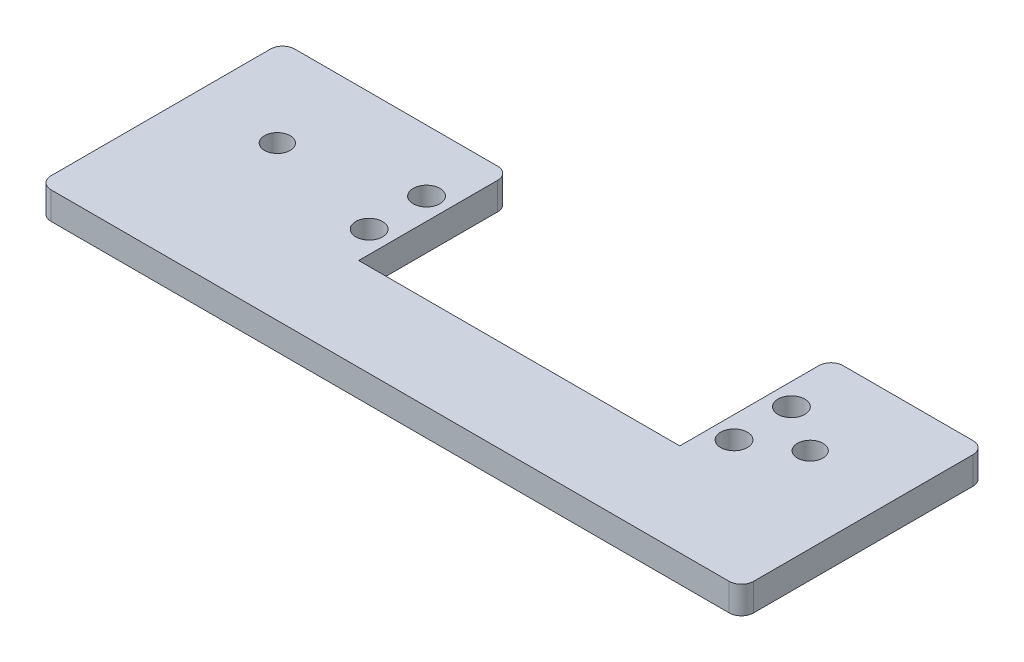
ISO-10303-21;
HEADER;
FILE_DESCRIPTION(('STEP AP214'),'2;1');
FILE_NAME('part.step','',(''),(''),'','','');
FILE_SCHEMA(('AUTOMOTIVE_DESIGN { 1 0 10303 214 1 1 1 1 }'));
ENDSEC;
DATA;
#1=APPLICATION_CONTEXT('core data for automotive mechanical design processes');
#2=APPLICATION_PROTOCOL_DEFINITION('international standard','automotive_design',2000,#1);
#3=PRODUCT_CONTEXT('',#1,'mechanical');
#4=PRODUCT('Part','Part','',(#3));
#5=PRODUCT_RELATED_PRODUCT_CATEGORY('part','',(#4));
#6=PRODUCT_DEFINITION_FORMATION('','',#4);
#7=PRODUCT_DEFINITION_CONTEXT('part definition',#1,'design');
#8=PRODUCT_DEFINITION('design','',#6,#7);
#9=PRODUCT_DEFINITION_SHAPE('','',#8);
#10=(LENGTH_UNIT() NAMED_UNIT(*) SI_UNIT(.MILLI.,.METRE.));
#11=(NAMED_UNIT(*) PLANE_ANGLE_UNIT() SI_UNIT($,.RADIAN.));
#12=(NAMED_UNIT(*) SI_UNIT($,.STERADIAN.) SOLID_ANGLE_UNIT());
#13=UNCERTAINTY_MEASURE_WITH_UNIT(LENGTH_MEASURE(1.E-05),#10,'distance_accuracy_value','');
#14=(GEOMETRIC_REPRESENTATION_CONTEXT(3) GLOBAL_UNCERTAINTY_ASSIGNED_CONTEXT((#13)) GLOBAL_UNIT_ASSIGNED_CONTEXT((#10,
#11,#12)) REPRESENTATION_CONTEXT('',''));
#15=CARTESIAN_POINT('',(0.,0.,0.));
#16=DIRECTION('',(0.,0.,1.));
#17=DIRECTION('',(1.,0.,0.));
#18=AXIS2_PLACEMENT_3D('',#15,#16,#17);
#19=CARTESIAN_POINT('',(34.40167516,4.5,-18.0390035104876));
#20=DIRECTION('',(0.,-1.,0.));
#21=DIRECTION('',(0.,0.,-1.));
#22=AXIS2_PLACEMENT_3D('',#19,#20,#21);
#23=PLANE('',#22);
#24=CARTESIAN_POINT('',(36.0016750719999,4.5,-0.504003432487632));
#25=DIRECTION('',(0.,1.,0.));
#26=DIRECTION('',(0.,0.,1.));
#27=AXIS2_PLACEMENT_3D('',#24,#25,#26);
#28=CIRCLE('',#27,2.2);
#29=CARTESIAN_POINT('',(36.0016750719999,4.5,1.69599656751237));
#30=VERTEX_POINT('',#29);
#31=EDGE_CURVE('E326',#30,#30,#28,.T.);
#32=ORIENTED_EDGE('',*,*,#31,.F.);
#33=EDGE_LOOP('',(#32));
#34=FACE_BOUND('',#33,.T.);
#35=CARTESIAN_POINT('',(-23.988324752,4.5,-9.93400343248761));
#36=DIRECTION('',(0.,1.,0.));
#37=DIRECTION('',(0.,0.,1.));
#38=AXIS2_PLACEMENT_3D('',#35,#36,#37);
#39=CIRCLE('',#38,2.2);
#40=CARTESIAN_POINT('',(-23.988324752,4.5,-7.7340034324876));
#41=VERTEX_POINT('',#40);
#42=EDGE_CURVE('E338',#41,#41,#39,.T.);
#43=ORIENTED_EDGE('',*,*,#42,.F.);
#44=EDGE_LOOP('',(#43));
#45=FACE_BOUND('',#44,.T.);
#46=CARTESIAN_POINT('',(-43.8023,4.5,-5.21900343248762));
#47=DIRECTION('',(0.,1.,0.));
#48=DIRECTION('',(0.,0.,1.));
#49=AXIS2_PLACEMENT_3D('',#46,#47,#48);
#50=CIRCLE('',#49,2.1082);
#51=CARTESIAN_POINT('',(-43.8023,4.5,-3.11080343248762));
#52=VERTEX_POINT('',#51);
#53=EDGE_CURVE('E170',#52,#52,#50,.T.);
#54=ORIENTED_EDGE('',*,*,#53,.F.);
#55=EDGE_LOOP('',(#54));
#56=FACE_BOUND('',#55,.T.);
#57=DIRECTION('',(-1.,0.,0.));
#58=VECTOR('',#57,1.);
#59=CARTESIAN_POINT('',(-20.38832484,4.5,4.81599656751238));
#60=LINE('',#59,#58);
#61=CARTESIAN_POINT('',(32.40167516,4.5,4.81599656751238));
#62=VERTEX_POINT('',#61);
#63=CARTESIAN_POINT('',(-20.38832484,4.5,4.81599656751238));
#64=VERTEX_POINT('',#63);
#65=EDGE_CURVE('E193',#62,#64,#60,.T.);
#66=ORIENTED_EDGE('',*,*,#65,.T.);
#67=DIRECTION('',(0.,0.,-1.));
#68=VECTOR('',#67,1.);
#69=CARTESIAN_POINT('',(-20.38832484,4.5,-18.0390035104876));
#70=LINE('',#69,#68);
#71=CARTESIAN_POINT('',(-20.38832484,4.5,-18.0390035104876));
#72=VERTEX_POINT('',#71);
#73=EDGE_CURVE('E111',#64,#72,#70,.T.);
#74=ORIENTED_EDGE('',*,*,#73,.T.);
#75=CARTESIAN_POINT('',(-22.38832484,4.5,-18.0390035104876));
#76=DIRECTION('',(0.,1.,0.));
#77=DIRECTION('',(0.,0.,1.));
#78=AXIS2_PLACEMENT_3D('',#75,#76,#77);
#79=CIRCLE('',#78,2.);
#80=CARTESIAN_POINT('',(-22.38832484,4.5,-20.0390035104876));
#81=VERTEX_POINT('',#80);
#82=EDGE_CURVE('E226',#72,#81,#79,.T.);
#83=ORIENTED_EDGE('',*,*,#82,.T.);
#84=DIRECTION('',(-1.,0.,0.));
#85=VECTOR('',#84,1.);
#86=CARTESIAN_POINT('',(-22.38832484,4.5,-20.0390035104876));
#87=LINE('',#86,#85);
#88=CARTESIAN_POINT('',(-55.75,4.5,-20.0390035104876));
#89=VERTEX_POINT('',#88);
#90=EDGE_CURVE('E245',#81,#89,#87,.T.);
#91=ORIENTED_EDGE('',*,*,#90,.T.);
#92=CARTESIAN_POINT('',(-55.75,4.5,-18.0390035104876));
#93=DIRECTION('',(0.,1.,0.));
#94=DIRECTION('',(0.,0.,1.));
#95=AXIS2_PLACEMENT_3D('',#92,#93,#94);
#96=CIRCLE('',#95,2.);
#97=CARTESIAN_POINT('',(-57.75,4.5,-18.0390035104876));
#98=VERTEX_POINT('',#97);
#99=EDGE_CURVE('E242',#89,#98,#96,.T.);
#100=ORIENTED_EDGE('',*,*,#99,.T.);
#101=DIRECTION('',(0.,0.,1.));
#102=VECTOR('',#101,1.);
#103=CARTESIAN_POINT('',(-57.75,4.5,-18.0390035104876));
#104=LINE('',#103,#102);
#105=CARTESIAN_POINT('',(-57.75,4.5,18.0390035104876));
#106=VERTEX_POINT('',#105);
#107=EDGE_CURVE('E244',#98,#106,#104,.T.);
#108=ORIENTED_EDGE('',*,*,#107,.T.);
#109=CARTESIAN_POINT('',(-55.75,4.5,18.0390035104876));
#110=DIRECTION('',(0.,1.,0.));
#111=DIRECTION('',(0.,0.,-1.));
#112=AXIS2_PLACEMENT_3D('',#109,#110,#111);
#113=CIRCLE('',#112,2.);
#114=CARTESIAN_POINT('',(-55.75,4.5,20.0390035104876));
#115=VERTEX_POINT('',#114);
#116=EDGE_CURVE('E247',#106,#115,#113,.T.);
#117=ORIENTED_EDGE('',*,*,#116,.T.);
#118=DIRECTION('',(1.,0.,0.));
#119=VECTOR('',#118,1.);
#120=CARTESIAN_POINT('',(55.7499999999999,4.5,20.0390035104876));
#121=LINE('',#120,#119);
#122=CARTESIAN_POINT('',(55.7499999999999,4.5,20.0390035104876));
#123=VERTEX_POINT('',#122);
#124=EDGE_CURVE('E253',#115,#123,#121,.T.);
#125=ORIENTED_EDGE('',*,*,#124,.T.);
#126=CARTESIAN_POINT('',(55.7499999999999,4.5,18.0390035104876));
#127=DIRECTION('',(0.,1.,0.));
#128=DIRECTION('',(0.,0.,-1.));
#129=AXIS2_PLACEMENT_3D('',#126,#127,#128);
#130=CIRCLE('',#129,2.);
#131=CARTESIAN_POINT('',(57.7499999999999,4.5,18.0390035104876));
#132=VERTEX_POINT('',#131);
#133=EDGE_CURVE('E255',#123,#132,#130,.T.);
#134=ORIENTED_EDGE('',*,*,#133,.T.);
#135=DIRECTION('',(0.,0.,-1.));
#136=VECTOR('',#135,1.);
#137=CARTESIAN_POINT('',(57.7499999999999,4.5,-18.0390035104876));
#138=LINE('',#137,#136);
#139=CARTESIAN_POINT('',(57.7499999999999,4.5,-18.0390035104876));
#140=VERTEX_POINT('',#139);
#141=EDGE_CURVE('E257',#132,#140,#138,.T.);
#142=ORIENTED_EDGE('',*,*,#141,.T.);
#143=CARTESIAN_POINT('',(55.7499999999999,4.5,-18.0390035104876));
#144=DIRECTION('',(0.,1.,0.));
#145=DIRECTION('',(0.,0.,-1.));
#146=AXIS2_PLACEMENT_3D('',#143,#144,#145);
#147=CIRCLE('',#146,2.);
#148=CARTESIAN_POINT('',(55.7499999999999,4.5,-20.0390035104876));
#149=VERTEX_POINT('',#148);
#150=EDGE_CURVE('E148',#140,#149,#147,.T.);
#151=ORIENTED_EDGE('',*,*,#150,.T.);
#152=DIRECTION('',(-1.,0.,0.));
#153=VECTOR('',#152,1.);
#154=CARTESIAN_POINT('',(55.7499999999999,4.5,-20.0390035104876));
#155=LINE('',#154,#153);
#156=CARTESIAN_POINT('',(34.40167516,4.5,-20.0390035104876));
#157=VERTEX_POINT('',#156);
#158=EDGE_CURVE('E142',#149,#157,#155,.T.);
#159=ORIENTED_EDGE('',*,*,#158,.T.);
#160=CARTESIAN_POINT('',(34.40167516,4.5,-18.0390035104876));
#161=DIRECTION('',(0.,1.,0.));
#162=DIRECTION('',(0.,0.,-1.));
#163=AXIS2_PLACEMENT_3D('',#160,#161,#162);
#164=CIRCLE('',#163,2.);
#165=CARTESIAN_POINT('',(32.40167516,4.5,-18.0390035104876));
#166=VERTEX_POINT('',#165);
#167=EDGE_CURVE('E146',#157,#166,#164,.T.);
#168=ORIENTED_EDGE('',*,*,#167,.T.);
#169=DIRECTION('',(0.,0.,1.));
#170=VECTOR('',#169,1.);
#171=CARTESIAN_POINT('',(32.40167516,4.5,-18.0390035104876));
#172=LINE('',#171,#170);
#173=EDGE_CURVE('E50',#166,#62,#172,.T.);
#174=ORIENTED_EDGE('',*,*,#173,.T.);
#175=EDGE_LOOP('',(#66,#74,#83,#91,#100,#108,#117,#125,#134,#142,#151,#159,#168,#174));
#176=FACE_BOUND('',#175,.T.);
#177=CARTESIAN_POINT('',(43.8023,4.5,-5.21900343248762));
#178=DIRECTION('',(0.,1.,0.));
#179=DIRECTION('',(0.,0.,-1.));
#180=AXIS2_PLACEMENT_3D('',#177,#178,#179);
#181=CIRCLE('',#180,2.1082);
#182=CARTESIAN_POINT('',(43.8023,4.5,-7.32720343248762));
#183=VERTEX_POINT('',#182);
#184=EDGE_CURVE('E344',#183,#183,#181,.T.);
#185=ORIENTED_EDGE('',*,*,#184,.F.);
#186=EDGE_LOOP('',(#185));
#187=FACE_BOUND('',#186,.T.);
#188=CARTESIAN_POINT('',(36.001675072,4.5,-9.93400343248761));
#189=DIRECTION('',(0.,1.,0.));
#190=DIRECTION('',(0.,0.,-1.));
#191=AXIS2_PLACEMENT_3D('',#188,#189,#190);
#192=CIRCLE('',#191,2.2);
#193=CARTESIAN_POINT('',(36.001675072,4.5,-12.1340034324876));
#194=VERTEX_POINT('',#193);
#195=EDGE_CURVE('E332',#194,#194,#192,.T.);
#196=ORIENTED_EDGE('',*,*,#195,.F.);
#197=EDGE_LOOP('',(#196));
#198=FACE_BOUND('',#197,.T.);
#199=CARTESIAN_POINT('',(-23.988324752,4.5,-0.504003432487632));
#200=DIRECTION('',(0.,1.,0.));
#201=DIRECTION('',(0.,0.,-1.));
#202=AXIS2_PLACEMENT_3D('',#199,#200,#201);
#203=CIRCLE('',#202,2.2);
#204=CARTESIAN_POINT('',(-23.988324752,4.5,-2.70400343248763));
#205=VERTEX_POINT('',#204);
#206=EDGE_CURVE('E317',#205,#205,#203,.T.);
#207=ORIENTED_EDGE('',*,*,#206,.F.);
#208=EDGE_LOOP('',(#207));
#209=FACE_BOUND('',#208,.T.);
#210=ADVANCED_FACE('F33',(#34,#45,#56,#176,#187,#198,#209),#23,.F.);
#211=CARTESIAN_POINT('',(34.40167516,0.,-18.0390035104876));
#212=DIRECTION('',(0.,-1.,0.));
#213=DIRECTION('',(0.,0.,-1.));
#214=AXIS2_PLACEMENT_3D('',#211,#212,#213);
#215=PLANE('',#214);
#216=CARTESIAN_POINT('',(36.0016750719999,0.,-0.504003432487632));
#217=DIRECTION('',(0.,1.,0.));
#218=DIRECTION('',(0.,0.,1.));
#219=AXIS2_PLACEMENT_3D('',#216,#217,#218);
#220=CIRCLE('',#219,2.2);
#221=CARTESIAN_POINT('',(36.0016750719999,0.,1.69599656751237));
#222=VERTEX_POINT('',#221);
#223=EDGE_CURVE('E323',#222,#222,#220,.T.);
#224=ORIENTED_EDGE('',*,*,#223,.T.);
#225=EDGE_LOOP('',(#224));
#226=FACE_BOUND('',#225,.T.);
#227=CARTESIAN_POINT('',(-23.988324752,0.,-9.93400343248761));
#228=DIRECTION('',(0.,1.,0.));
#229=DIRECTION('',(0.,0.,1.));
#230=AXIS2_PLACEMENT_3D('',#227,#228,#229);
#231=CIRCLE('',#230,2.2);
#232=CARTESIAN_POINT('',(-23.988324752,0.,-7.7340034324876));
#233=VERTEX_POINT('',#232);
#234=EDGE_CURVE('E335',#233,#233,#231,.T.);
#235=ORIENTED_EDGE('',*,*,#234,.T.);
#236=EDGE_LOOP('',(#235));
#237=FACE_BOUND('',#236,.T.);
#238=CARTESIAN_POINT('',(-43.8023,0.,-5.21900343248762));
#239=DIRECTION('',(0.,1.,0.));
#240=DIRECTION('',(0.,0.,1.));
#241=AXIS2_PLACEMENT_3D('',#238,#239,#240);
#242=CIRCLE('',#241,2.1082);
#243=CARTESIAN_POINT('',(-43.8023,0.,-3.11080343248762));
#244=VERTEX_POINT('',#243);
#245=EDGE_CURVE('E347',#244,#244,#242,.T.);
#246=ORIENTED_EDGE('',*,*,#245,.T.);
#247=EDGE_LOOP('',(#246));
#248=FACE_BOUND('',#247,.T.);
#249=DIRECTION('',(-1.,0.,0.));
#250=VECTOR('',#249,1.);
#251=CARTESIAN_POINT('',(-20.38832484,0.,4.81599656751238));
#252=LINE('',#251,#250);
#253=CARTESIAN_POINT('',(32.40167516,0.,4.81599656751238));
#254=VERTEX_POINT('',#253);
#255=CARTESIAN_POINT('',(-20.38832484,0.,4.81599656751238));
#256=VERTEX_POINT('',#255);
#257=EDGE_CURVE('E166',#254,#256,#252,.T.);
#258=ORIENTED_EDGE('',*,*,#257,.F.);
#259=DIRECTION('',(0.,0.,1.));
#260=VECTOR('',#259,1.);
#261=CARTESIAN_POINT('',(32.40167516,0.,-18.0390035104876));
#262=LINE('',#261,#260);
#263=CARTESIAN_POINT('',(32.40167516,0.,-18.0390035104876));
#264=VERTEX_POINT('',#263);
#265=EDGE_CURVE('E103',#264,#254,#262,.T.);
#266=ORIENTED_EDGE('',*,*,#265,.F.);
#267=CARTESIAN_POINT('',(34.40167516,0.,-18.0390035104876));
#268=DIRECTION('',(0.,1.,0.));
#269=DIRECTION('',(0.,0.,-1.));
#270=AXIS2_PLACEMENT_3D('',#267,#268,#269);
#271=CIRCLE('',#270,2.);
#272=CARTESIAN_POINT('',(34.40167516,0.,-20.0390035104876));
#273=VERTEX_POINT('',#272);
#274=EDGE_CURVE('E97',#273,#264,#271,.T.);
#275=ORIENTED_EDGE('',*,*,#274,.F.);
#276=DIRECTION('',(-1.,0.,0.));
#277=VECTOR('',#276,1.);
#278=CARTESIAN_POINT('',(55.7499999999999,0.,-20.0390035104876));
#279=LINE('',#278,#277);
#280=CARTESIAN_POINT('',(55.7499999999999,0.,-20.0390035104876));
#281=VERTEX_POINT('',#280);
#282=EDGE_CURVE('E156',#281,#273,#279,.T.);
#283=ORIENTED_EDGE('',*,*,#282,.F.);
#284=CARTESIAN_POINT('',(55.7499999999999,0.,-18.0390035104876));
#285=DIRECTION('',(0.,1.,0.));
#286=DIRECTION('',(0.,0.,-1.));
#287=AXIS2_PLACEMENT_3D('',#284,#285,#286);
#288=CIRCLE('',#287,2.);
#289=CARTESIAN_POINT('',(57.7499999999999,0.,-18.0390035104876));
#290=VERTEX_POINT('',#289);
#291=EDGE_CURVE('E188',#290,#281,#288,.T.);
#292=ORIENTED_EDGE('',*,*,#291,.F.);
#293=DIRECTION('',(0.,0.,-1.));
#294=VECTOR('',#293,1.);
#295=CARTESIAN_POINT('',(57.7499999999999,0.,-18.0390035104876));
#296=LINE('',#295,#294);
#297=CARTESIAN_POINT('',(57.7499999999999,0.,18.0390035104876));
#298=VERTEX_POINT('',#297);
#299=EDGE_CURVE('E186',#298,#290,#296,.T.);
#300=ORIENTED_EDGE('',*,*,#299,.F.);
#301=CARTESIAN_POINT('',(55.7499999999999,0.,18.0390035104876));
#302=DIRECTION('',(0.,1.,0.));
#303=DIRECTION('',(0.,0.,-1.));
#304=AXIS2_PLACEMENT_3D('',#301,#302,#303);
#305=CIRCLE('',#304,2.);
#306=CARTESIAN_POINT('',(55.7499999999999,0.,20.0390035104876));
#307=VERTEX_POINT('',#306);
#308=EDGE_CURVE('E184',#307,#298,#305,.T.);
#309=ORIENTED_EDGE('',*,*,#308,.F.);
#310=DIRECTION('',(1.,0.,0.));
#311=VECTOR('',#310,1.);
#312=CARTESIAN_POINT('',(55.7499999999999,0.,20.0390035104876));
#313=LINE('',#312,#311);
#314=CARTESIAN_POINT('',(-55.75,0.,20.0390035104876));
#315=VERTEX_POINT('',#314);
#316=EDGE_CURVE('E182',#315,#307,#313,.T.);
#317=ORIENTED_EDGE('',*,*,#316,.F.);
#318=CARTESIAN_POINT('',(-55.75,0.,18.0390035104876));
#319=DIRECTION('',(0.,1.,0.));
#320=DIRECTION('',(0.,0.,-1.));
#321=AXIS2_PLACEMENT_3D('',#318,#319,#320);
#322=CIRCLE('',#321,2.);
#323=CARTESIAN_POINT('',(-57.75,0.,18.0390035104876));
#324=VERTEX_POINT('',#323);
#325=EDGE_CURVE('E180',#324,#315,#322,.T.);
#326=ORIENTED_EDGE('',*,*,#325,.F.);
#327=DIRECTION('',(0.,0.,1.));
#328=VECTOR('',#327,1.);
#329=CARTESIAN_POINT('',(-57.75,0.,-18.0390035104876));
#330=LINE('',#329,#328);
#331=CARTESIAN_POINT('',(-57.75,0.,-18.0390035104876));
#332=VERTEX_POINT('',#331);
#333=EDGE_CURVE('E178',#332,#324,#330,.T.);
#334=ORIENTED_EDGE('',*,*,#333,.F.);
#335=CARTESIAN_POINT('',(-55.75,0.,-18.0390035104876));
#336=DIRECTION('',(0.,1.,0.));
#337=DIRECTION('',(0.,0.,1.));
#338=AXIS2_PLACEMENT_3D('',#335,#336,#337);
#339=CIRCLE('',#338,2.);
#340=CARTESIAN_POINT('',(-55.75,0.,-20.0390035104876));
#341=VERTEX_POINT('',#340);
#342=EDGE_CURVE('E176',#341,#332,#339,.T.);
#343=ORIENTED_EDGE('',*,*,#342,.F.);
#344=DIRECTION('',(-1.,0.,0.));
#345=VECTOR('',#344,1.);
#346=CARTESIAN_POINT('',(-22.38832484,0.,-20.0390035104876));
#347=LINE('',#346,#345);
#348=CARTESIAN_POINT('',(-22.38832484,0.,-20.0390035104876));
#349=VERTEX_POINT('',#348);
#350=EDGE_CURVE('E174',#349,#341,#347,.T.);
#351=ORIENTED_EDGE('',*,*,#350,.F.);
#352=CARTESIAN_POINT('',(-22.38832484,0.,-18.0390035104876));
#353=DIRECTION('',(0.,1.,0.));
#354=DIRECTION('',(0.,0.,1.));
#355=AXIS2_PLACEMENT_3D('',#352,#353,#354);
#356=CIRCLE('',#355,2.);
#357=CARTESIAN_POINT('',(-20.38832484,0.,-18.0390035104876));
#358=VERTEX_POINT('',#357);
#359=EDGE_CURVE('E172',#358,#349,#356,.T.);
#360=ORIENTED_EDGE('',*,*,#359,.F.);
#361=DIRECTION('',(0.,0.,-1.));
#362=VECTOR('',#361,1.);
#363=CARTESIAN_POINT('',(-20.38832484,0.,-18.0390035104876));
#364=LINE('',#363,#362);
#365=EDGE_CURVE('E169',#256,#358,#364,.T.);
#366=ORIENTED_EDGE('',*,*,#365,.F.);
#367=EDGE_LOOP('',(#258,#266,#275,#283,#292,#300,#309,#317,#326,#334,#343,#351,#360,#366));
#368=FACE_BOUND('',#367,.T.);
#369=CARTESIAN_POINT('',(43.8023,0.,-5.21900343248762));
#370=DIRECTION('',(0.,1.,0.));
#371=DIRECTION('',(0.,0.,-1.));
#372=AXIS2_PLACEMENT_3D('',#369,#370,#371);
#373=CIRCLE('',#372,2.1082);
#374=CARTESIAN_POINT('',(43.8023,0.,-7.32720343248762));
#375=VERTEX_POINT('',#374);
#376=EDGE_CURVE('E341',#375,#375,#373,.T.);
#377=ORIENTED_EDGE('',*,*,#376,.T.);
#378=EDGE_LOOP('',(#377));
#379=FACE_BOUND('',#378,.T.);
#380=CARTESIAN_POINT('',(36.001675072,0.,-9.93400343248761));
#381=DIRECTION('',(0.,1.,0.));
#382=DIRECTION('',(0.,0.,-1.));
#383=AXIS2_PLACEMENT_3D('',#380,#381,#382);
#384=CIRCLE('',#383,2.2);
#385=CARTESIAN_POINT('',(36.001675072,0.,-12.1340034324876));
#386=VERTEX_POINT('',#385);
#387=EDGE_CURVE('E329',#386,#386,#384,.T.);
#388=ORIENTED_EDGE('',*,*,#387,.T.);
#389=EDGE_LOOP('',(#388));
#390=FACE_BOUND('',#389,.T.);
#391=CARTESIAN_POINT('',(-23.988324752,0.,-0.504003432487632));
#392=DIRECTION('',(0.,1.,0.));
#393=DIRECTION('',(0.,0.,-1.));
#394=AXIS2_PLACEMENT_3D('',#391,#392,#393);
#395=CIRCLE('',#394,2.2);
#396=CARTESIAN_POINT('',(-23.988324752,0.,-2.70400343248763));
#397=VERTEX_POINT('',#396);
#398=EDGE_CURVE('E320',#397,#397,#395,.T.);
#399=ORIENTED_EDGE('',*,*,#398,.T.);
#400=EDGE_LOOP('',(#399));
#401=FACE_BOUND('',#400,.T.);
#402=ADVANCED_FACE('F230',(#226,#237,#248,#368,#379,#390,#401),#215,.T.);
#403=CARTESIAN_POINT('',(-20.38832484,4.5,4.81599656751238));
#404=DIRECTION('',(0.,0.,1.));
#405=DIRECTION('',(1.,0.,0.));
#406=AXIS2_PLACEMENT_3D('',#403,#404,#405);
#407=PLANE('',#406);
#408=ORIENTED_EDGE('',*,*,#257,.T.);
#409=DIRECTION('',(0.,-1.,0.));
#410=VECTOR('',#409,1.);
#411=CARTESIAN_POINT('',(-20.38832484,4.5,4.81599656751238));
#412=LINE('',#411,#410);
#413=EDGE_CURVE('E11',#64,#256,#412,.T.);
#414=ORIENTED_EDGE('',*,*,#413,.F.);
#415=ORIENTED_EDGE('',*,*,#65,.F.);
#416=DIRECTION('',(0.,-1.,0.));
#417=VECTOR('',#416,1.);
#418=CARTESIAN_POINT('',(32.40167516,4.5,4.81599656751238));
#419=LINE('',#418,#417);
#420=EDGE_CURVE('E162',#62,#254,#419,.T.);
#421=ORIENTED_EDGE('',*,*,#420,.T.);
#422=EDGE_LOOP('',(#408,#414,#415,#421));
#423=FACE_BOUND('',#422,.T.);
#424=ADVANCED_FACE('F35',(#423),#407,.F.);
#425=CARTESIAN_POINT('',(-20.38832484,4.5,-18.0390035104876));
#426=DIRECTION('',(-1.,0.,0.));
#427=DIRECTION('',(0.,0.,1.));
#428=AXIS2_PLACEMENT_3D('',#425,#426,#427);
#429=PLANE('',#428);
#430=ORIENTED_EDGE('',*,*,#365,.T.);
#431=DIRECTION('',(0.,-1.,0.));
#432=VECTOR('',#431,1.);
#433=CARTESIAN_POINT('',(-20.38832484,4.5,-18.0390035104876));
#434=LINE('',#433,#432);
#435=EDGE_CURVE('E42',#72,#358,#434,.T.);
#436=ORIENTED_EDGE('',*,*,#435,.F.);
#437=ORIENTED_EDGE('',*,*,#73,.F.);
#438=ORIENTED_EDGE('',*,*,#413,.T.);
#439=EDGE_LOOP('',(#430,#436,#437,#438));
#440=FACE_BOUND('',#439,.T.);
#441=ADVANCED_FACE('F494',(#440),#429,.F.);
#442=CARTESIAN_POINT('',(-22.38832484,4.5,-18.0390035104876));
#443=DIRECTION('',(0.,-1.,0.));
#444=DIRECTION('',(0.,0.,-1.));
#445=AXIS2_PLACEMENT_3D('',#442,#443,#444);
#446=CYLINDRICAL_SURFACE('',#445,2.);
#447=ORIENTED_EDGE('',*,*,#359,.T.);
#448=DIRECTION('',(0.,-1.,0.));
#449=VECTOR('',#448,1.);
#450=CARTESIAN_POINT('',(-22.38832484,4.5,-20.0390035104876));
#451=LINE('',#450,#449);
#452=EDGE_CURVE('E218',#81,#349,#451,.T.);
#453=ORIENTED_EDGE('',*,*,#452,.F.);
#454=ORIENTED_EDGE('',*,*,#82,.F.);
#455=ORIENTED_EDGE('',*,*,#435,.T.);
#456=EDGE_LOOP('',(#447,#453,#454,#455));
#457=FACE_BOUND('',#456,.T.);
#458=ADVANCED_FACE('F224',(#457),#446,.T.);
#459=CARTESIAN_POINT('',(-22.38832484,4.5,-20.0390035104876));
#460=DIRECTION('',(0.,0.,1.));
#461=DIRECTION('',(1.,0.,0.));
#462=AXIS2_PLACEMENT_3D('',#459,#460,#461);
#463=PLANE('',#462);
#464=ORIENTED_EDGE('',*,*,#350,.T.);
#465=DIRECTION('',(0.,-1.,0.));
#466=VECTOR('',#465,1.);
#467=CARTESIAN_POINT('',(-55.75,4.5,-20.0390035104876));
#468=LINE('',#467,#466);
#469=EDGE_CURVE('E215',#89,#341,#468,.T.);
#470=ORIENTED_EDGE('',*,*,#469,.F.);
#471=ORIENTED_EDGE('',*,*,#90,.F.);
#472=ORIENTED_EDGE('',*,*,#452,.T.);
#473=EDGE_LOOP('',(#464,#470,#471,#472));
#474=FACE_BOUND('',#473,.T.);
#475=ADVANCED_FACE('F236',(#474),#463,.F.);
#476=CARTESIAN_POINT('',(-55.75,4.5,-18.0390035104876));
#477=DIRECTION('',(0.,-1.,0.));
#478=DIRECTION('',(0.,0.,-1.));
#479=AXIS2_PLACEMENT_3D('',#476,#477,#478);
#480=CYLINDRICAL_SURFACE('',#479,2.);
#481=ORIENTED_EDGE('',*,*,#342,.T.);
#482=DIRECTION('',(0.,-1.,0.));
#483=VECTOR('',#482,1.);
#484=CARTESIAN_POINT('',(-57.75,4.5,-18.0390035104876));
#485=LINE('',#484,#483);
#486=EDGE_CURVE('E212',#98,#332,#485,.T.);
#487=ORIENTED_EDGE('',*,*,#486,.F.);
#488=ORIENTED_EDGE('',*,*,#99,.F.);
#489=ORIENTED_EDGE('',*,*,#469,.T.);
#490=EDGE_LOOP('',(#481,#487,#488,#489));
#491=FACE_BOUND('',#490,.T.);
#492=ADVANCED_FACE('F240',(#491),#480,.T.);
#493=CARTESIAN_POINT('',(-57.75,4.5,-18.0390035104876));
#494=DIRECTION('',(1.,0.,0.));
#495=DIRECTION('',(0.,0.,-1.));
#496=AXIS2_PLACEMENT_3D('',#493,#494,#495);
#497=PLANE('',#496);
#498=ORIENTED_EDGE('',*,*,#333,.T.);
#499=DIRECTION('',(0.,-1.,0.));
#500=VECTOR('',#499,1.);
#501=CARTESIAN_POINT('',(-57.75,4.5,18.0390035104876));
#502=LINE('',#501,#500);
#503=EDGE_CURVE('E209',#106,#324,#502,.T.);
#504=ORIENTED_EDGE('',*,*,#503,.F.);
#505=ORIENTED_EDGE('',*,*,#107,.F.);
#506=ORIENTED_EDGE('',*,*,#486,.T.);
#507=EDGE_LOOP('',(#498,#504,#505,#506));
#508=FACE_BOUND('',#507,.T.);
#509=ADVANCED_FACE('F459',(#508),#497,.F.);
#510=CARTESIAN_POINT('',(-55.75,4.5,18.0390035104876));
#511=DIRECTION('',(0.,-1.,0.));
#512=DIRECTION('',(0.,0.,-1.));
#513=AXIS2_PLACEMENT_3D('',#510,#511,#512);
#514=CYLINDRICAL_SURFACE('',#513,2.);
#515=ORIENTED_EDGE('',*,*,#325,.T.);
#516=DIRECTION('',(0.,-1.,0.));
#517=VECTOR('',#516,1.);
#518=CARTESIAN_POINT('',(-55.75,4.5,20.0390035104876));
#519=LINE('',#518,#517);
#520=EDGE_CURVE('E206',#115,#315,#519,.T.);
#521=ORIENTED_EDGE('',*,*,#520,.F.);
#522=ORIENTED_EDGE('',*,*,#116,.F.);
#523=ORIENTED_EDGE('',*,*,#503,.T.);
#524=EDGE_LOOP('',(#515,#521,#522,#523));
#525=FACE_BOUND('',#524,.T.);
#526=ADVANCED_FACE('F449',(#525),#514,.T.);
#527=CARTESIAN_POINT('',(55.7499999999999,4.5,20.0390035104876));
#528=DIRECTION('',(0.,0.,-1.));
#529=DIRECTION('',(-1.,0.,0.));
#530=AXIS2_PLACEMENT_3D('',#527,#528,#529);
#531=PLANE('',#530);
#532=ORIENTED_EDGE('',*,*,#316,.T.);
#533=DIRECTION('',(0.,-1.,0.));
#534=VECTOR('',#533,1.);
#535=CARTESIAN_POINT('',(55.7499999999999,4.5,20.0390035104876));
#536=LINE('',#535,#534);
#537=EDGE_CURVE('E203',#123,#307,#536,.T.);
#538=ORIENTED_EDGE('',*,*,#537,.F.);
#539=ORIENTED_EDGE('',*,*,#124,.F.);
#540=ORIENTED_EDGE('',*,*,#520,.T.);
#541=EDGE_LOOP('',(#532,#538,#539,#540));
#542=FACE_BOUND('',#541,.T.);
#543=ADVANCED_FACE('F439',(#542),#531,.F.);
#544=CARTESIAN_POINT('',(55.7499999999999,4.5,18.0390035104876));
#545=DIRECTION('',(0.,-1.,0.));
#546=DIRECTION('',(0.,0.,-1.));
#547=AXIS2_PLACEMENT_3D('',#544,#545,#546);
#548=CYLINDRICAL_SURFACE('',#547,2.);
#549=ORIENTED_EDGE('',*,*,#308,.T.);
#550=DIRECTION('',(0.,-1.,0.));
#551=VECTOR('',#550,1.);
#552=CARTESIAN_POINT('',(57.7499999999999,4.5,18.0390035104876));
#553=LINE('',#552,#551);
#554=EDGE_CURVE('E200',#132,#298,#553,.T.);
#555=ORIENTED_EDGE('',*,*,#554,.F.);
#556=ORIENTED_EDGE('',*,*,#133,.F.);
#557=ORIENTED_EDGE('',*,*,#537,.T.);
#558=EDGE_LOOP('',(#549,#555,#556,#557));
#559=FACE_BOUND('',#558,.T.);
#560=ADVANCED_FACE('F430',(#559),#548,.T.);
#561=CARTESIAN_POINT('',(57.7499999999999,4.5,-18.0390035104876));
#562=DIRECTION('',(-1.,0.,0.));
#563=DIRECTION('',(0.,0.,1.));
#564=AXIS2_PLACEMENT_3D('',#561,#562,#563);
#565=PLANE('',#564);
#566=ORIENTED_EDGE('',*,*,#299,.T.);
#567=DIRECTION('',(0.,-1.,0.));
#568=VECTOR('',#567,1.);
#569=CARTESIAN_POINT('',(57.7499999999999,4.5,-18.0390035104876));
#570=LINE('',#569,#568);
#571=EDGE_CURVE('E197',#140,#290,#570,.T.);
#572=ORIENTED_EDGE('',*,*,#571,.F.);
#573=ORIENTED_EDGE('',*,*,#141,.F.);
#574=ORIENTED_EDGE('',*,*,#554,.T.);
#575=EDGE_LOOP('',(#566,#572,#573,#574));
#576=FACE_BOUND('',#575,.T.);
#577=ADVANCED_FACE('F263',(#576),#565,.F.);
#578=CARTESIAN_POINT('',(55.7499999999999,4.5,-18.0390035104876));
#579=DIRECTION('',(0.,-1.,0.));
#580=DIRECTION('',(0.,0.,-1.));
#581=AXIS2_PLACEMENT_3D('',#578,#579,#580);
#582=CYLINDRICAL_SURFACE('',#581,2.);
#583=ORIENTED_EDGE('',*,*,#291,.T.);
#584=DIRECTION('',(0.,-1.,0.));
#585=VECTOR('',#584,1.);
#586=CARTESIAN_POINT('',(55.7499999999999,4.5,-20.0390035104876));
#587=LINE('',#586,#585);
#588=EDGE_CURVE('E157',#149,#281,#587,.T.);
#589=ORIENTED_EDGE('',*,*,#588,.F.);
#590=ORIENTED_EDGE('',*,*,#150,.F.);
#591=ORIENTED_EDGE('',*,*,#571,.T.);
#592=EDGE_LOOP('',(#583,#589,#590,#591));
#593=FACE_BOUND('',#592,.T.);
#594=ADVANCED_FACE('F267',(#593),#582,.T.);
#595=CARTESIAN_POINT('',(55.7499999999999,4.5,-20.0390035104876));
#596=DIRECTION('',(0.,0.,1.));
#597=DIRECTION('',(1.,0.,0.));
#598=AXIS2_PLACEMENT_3D('',#595,#596,#597);
#599=PLANE('',#598);
#600=ORIENTED_EDGE('',*,*,#282,.T.);
#601=DIRECTION('',(0.,-1.,0.));
#602=VECTOR('',#601,1.);
#603=CARTESIAN_POINT('',(34.40167516,4.5,-20.0390035104876));
#604=LINE('',#603,#602);
#605=EDGE_CURVE('E153',#157,#273,#604,.T.);
#606=ORIENTED_EDGE('',*,*,#605,.F.);
#607=ORIENTED_EDGE('',*,*,#158,.F.);
#608=ORIENTED_EDGE('',*,*,#588,.T.);
#609=EDGE_LOOP('',(#600,#606,#607,#608));
#610=FACE_BOUND('',#609,.T.);
#611=ADVANCED_FACE('F154',(#610),#599,.F.);
#612=CARTESIAN_POINT('',(34.40167516,4.5,-18.0390035104876));
#613=DIRECTION('',(0.,-1.,0.));
#614=DIRECTION('',(0.,0.,-1.));
#615=AXIS2_PLACEMENT_3D('',#612,#613,#614);
#616=CYLINDRICAL_SURFACE('',#615,2.);
#617=ORIENTED_EDGE('',*,*,#274,.T.);
#618=DIRECTION('',(0.,-1.,0.));
#619=VECTOR('',#618,1.);
#620=CARTESIAN_POINT('',(32.40167516,4.5,-18.0390035104876));
#621=LINE('',#620,#619);
#622=EDGE_CURVE('E158',#166,#264,#621,.T.);
#623=ORIENTED_EDGE('',*,*,#622,.F.);
#624=ORIENTED_EDGE('',*,*,#167,.F.);
#625=ORIENTED_EDGE('',*,*,#605,.T.);
#626=EDGE_LOOP('',(#617,#623,#624,#625));
#627=FACE_BOUND('',#626,.T.);
#628=ADVANCED_FACE('F160',(#627),#616,.T.);
#629=CARTESIAN_POINT('',(32.40167516,4.5,-18.0390035104876));
#630=DIRECTION('',(1.,0.,0.));
#631=DIRECTION('',(0.,0.,-1.));
#632=AXIS2_PLACEMENT_3D('',#629,#630,#631);
#633=PLANE('',#632);
#634=ORIENTED_EDGE('',*,*,#265,.T.);
#635=ORIENTED_EDGE('',*,*,#420,.F.);
#636=ORIENTED_EDGE('',*,*,#173,.F.);
#637=ORIENTED_EDGE('',*,*,#622,.T.);
#638=EDGE_LOOP('',(#634,#635,#636,#637));
#639=FACE_BOUND('',#638,.T.);
#640=ADVANCED_FACE('F271',(#639),#633,.F.);
#641=CARTESIAN_POINT('',(-43.8023,4.5,-5.21900343248762));
#642=DIRECTION('',(0.,-1.,0.));
#643=DIRECTION('',(0.,0.,-1.));
#644=AXIS2_PLACEMENT_3D('',#641,#642,#643);
#645=CYLINDRICAL_SURFACE('',#644,2.1082);
#646=ORIENTED_EDGE('',*,*,#53,.T.);
#647=EDGE_LOOP('',(#646));
#648=FACE_BOUND('',#647,.T.);
#649=ORIENTED_EDGE('',*,*,#245,.F.);
#650=EDGE_LOOP('',(#649));
#651=FACE_BOUND('',#650,.T.);
#652=ADVANCED_FACE('F273',(#648,#651),#645,.F.);
#653=CARTESIAN_POINT('',(43.8023,4.5,-5.21900343248762));
#654=DIRECTION('',(0.,-1.,0.));
#655=DIRECTION('',(0.,0.,-1.));
#656=AXIS2_PLACEMENT_3D('',#653,#654,#655);
#657=CYLINDRICAL_SURFACE('',#656,2.1082);
#658=ORIENTED_EDGE('',*,*,#184,.T.);
#659=EDGE_LOOP('',(#658));
#660=FACE_BOUND('',#659,.T.);
#661=ORIENTED_EDGE('',*,*,#376,.F.);
#662=EDGE_LOOP('',(#661));
#663=FACE_BOUND('',#662,.T.);
#664=ADVANCED_FACE('F279',(#660,#663),#657,.F.);
#665=CARTESIAN_POINT('',(-23.988324752,4.5,-9.93400343248761));
#666=DIRECTION('',(0.,-1.,0.));
#667=DIRECTION('',(0.,0.,-1.));
#668=AXIS2_PLACEMENT_3D('',#665,#666,#667);
#669=CYLINDRICAL_SURFACE('',#668,2.2);
#670=ORIENTED_EDGE('',*,*,#42,.T.);
#671=EDGE_LOOP('',(#670));
#672=FACE_BOUND('',#671,.T.);
#673=ORIENTED_EDGE('',*,*,#234,.F.);
#674=EDGE_LOOP('',(#673));
#675=FACE_BOUND('',#674,.T.);
#676=ADVANCED_FACE('F296',(#672,#675),#669,.F.);
#677=CARTESIAN_POINT('',(36.001675072,4.5,-9.93400343248761));
#678=DIRECTION('',(0.,-1.,0.));
#679=DIRECTION('',(0.,0.,-1.));
#680=AXIS2_PLACEMENT_3D('',#677,#678,#679);
#681=CYLINDRICAL_SURFACE('',#680,2.2);
#682=ORIENTED_EDGE('',*,*,#195,.T.);
#683=EDGE_LOOP('',(#682));
#684=FACE_BOUND('',#683,.T.);
#685=ORIENTED_EDGE('',*,*,#387,.F.);
#686=EDGE_LOOP('',(#685));
#687=FACE_BOUND('',#686,.T.);
#688=ADVANCED_FACE('F300',(#684,#687),#681,.F.);
#689=CARTESIAN_POINT('',(36.0016750719999,4.5,-0.504003432487632));
#690=DIRECTION('',(0.,-1.,0.));
#691=DIRECTION('',(0.,0.,-1.));
#692=AXIS2_PLACEMENT_3D('',#689,#690,#691);
#693=CYLINDRICAL_SURFACE('',#692,2.2);
#694=ORIENTED_EDGE('',*,*,#31,.T.);
#695=EDGE_LOOP('',(#694));
#696=FACE_BOUND('',#695,.T.);
#697=ORIENTED_EDGE('',*,*,#223,.F.);
#698=EDGE_LOOP('',(#697));
#699=FACE_BOUND('',#698,.T.);
#700=ADVANCED_FACE('F304',(#696,#699),#693,.F.);
#701=CARTESIAN_POINT('',(-23.988324752,4.5,-0.504003432487632));
#702=DIRECTION('',(0.,-1.,0.));
#703=DIRECTION('',(0.,0.,-1.));
#704=AXIS2_PLACEMENT_3D('',#701,#702,#703);
#705=CYLINDRICAL_SURFACE('',#704,2.2);
#706=ORIENTED_EDGE('',*,*,#206,.T.);
#707=EDGE_LOOP('',(#706));
#708=FACE_BOUND('',#707,.T.);
#709=ORIENTED_EDGE('',*,*,#398,.F.);
#710=EDGE_LOOP('',(#709));
#711=FACE_BOUND('',#710,.T.);
#712=ADVANCED_FACE('F308',(#708,#711),#705,.F.);
#713=CLOSED_SHELL('',(#210,#402,#424,#441,#458,#475,#492,#509,#526,#543,#560,#577,#594,#611,
#628,#640,#652,#664,#676,#688,#700,#712));
#714=MANIFOLD_SOLID_BREP('B2',#713);
#715=ADVANCED_BREP_SHAPE_REPRESENTATION('',(#18,#714),#14);
#716=SHAPE_DEFINITION_REPRESENTATION(#9,#715);
ENDSEC;
END-ISO-10303-21;
